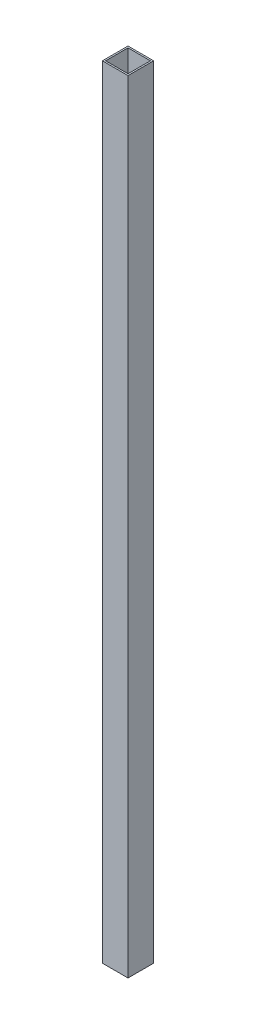
ISO-10303-21;
HEADER;
FILE_DESCRIPTION(('STEP AP214'),'2;1');
FILE_NAME('part.step','',(''),(''),'','','');
FILE_SCHEMA(('AUTOMOTIVE_DESIGN { 1 0 10303 214 1 1 1 1 }'));
ENDSEC;
DATA;
#1=APPLICATION_CONTEXT('core data for automotive mechanical design processes');
#2=APPLICATION_PROTOCOL_DEFINITION('international standard','automotive_design',2000,#1);
#3=PRODUCT_CONTEXT('',#1,'mechanical');
#4=PRODUCT('Part','Part','',(#3));
#5=PRODUCT_RELATED_PRODUCT_CATEGORY('part','',(#4));
#6=PRODUCT_DEFINITION_FORMATION('','',#4);
#7=PRODUCT_DEFINITION_CONTEXT('part definition',#1,'design');
#8=PRODUCT_DEFINITION('design','',#6,#7);
#9=PRODUCT_DEFINITION_SHAPE('','',#8);
#10=(LENGTH_UNIT() NAMED_UNIT(*) SI_UNIT(.MILLI.,.METRE.));
#11=(NAMED_UNIT(*) PLANE_ANGLE_UNIT() SI_UNIT($,.RADIAN.));
#12=(NAMED_UNIT(*) SI_UNIT($,.STERADIAN.) SOLID_ANGLE_UNIT());
#13=UNCERTAINTY_MEASURE_WITH_UNIT(LENGTH_MEASURE(1.E-05),#10,'distance_accuracy_value','');
#14=(GEOMETRIC_REPRESENTATION_CONTEXT(3) GLOBAL_UNCERTAINTY_ASSIGNED_CONTEXT((#13)) GLOBAL_UNIT_ASSIGNED_CONTEXT((#10,
#11,#12)) REPRESENTATION_CONTEXT('',''));
#15=CARTESIAN_POINT('',(0.,0.,0.));
#16=DIRECTION('',(0.,0.,1.));
#17=DIRECTION('',(1.,0.,0.));
#18=AXIS2_PLACEMENT_3D('',#15,#16,#17);
#19=CARTESIAN_POINT('',(0.,774.7,0.));
#20=DIRECTION('',(0.,-1.,0.));
#21=DIRECTION('',(0.,0.,-1.));
#22=AXIS2_PLACEMENT_3D('',#19,#20,#21);
#23=PLANE('',#22);
#24=DIRECTION('',(0.,0.,-1.));
#25=VECTOR('',#24,1.);
#26=CARTESIAN_POINT('',(12.7,774.7,12.7));
#27=LINE('',#26,#25);
#28=CARTESIAN_POINT('',(12.7,774.7,12.7));
#29=VERTEX_POINT('',#28);
#30=CARTESIAN_POINT('',(12.7,774.7,-12.7));
#31=VERTEX_POINT('',#30);
#32=EDGE_CURVE('E133',#29,#31,#27,.T.);
#33=ORIENTED_EDGE('',*,*,#32,.T.);
#34=DIRECTION('',(-1.,0.,0.));
#35=VECTOR('',#34,1.);
#36=CARTESIAN_POINT('',(-12.7,774.7,-12.7));
#37=LINE('',#36,#35);
#38=CARTESIAN_POINT('',(-12.7,774.7,-12.7));
#39=VERTEX_POINT('',#38);
#40=EDGE_CURVE('E136',#31,#39,#37,.T.);
#41=ORIENTED_EDGE('',*,*,#40,.T.);
#42=DIRECTION('',(0.,0.,1.));
#43=VECTOR('',#42,1.);
#44=CARTESIAN_POINT('',(-12.7,774.7,12.7));
#45=LINE('',#44,#43);
#46=CARTESIAN_POINT('',(-12.7,774.7,12.7));
#47=VERTEX_POINT('',#46);
#48=EDGE_CURVE('E139',#39,#47,#45,.T.);
#49=ORIENTED_EDGE('',*,*,#48,.T.);
#50=DIRECTION('',(1.,0.,0.));
#51=VECTOR('',#50,1.);
#52=CARTESIAN_POINT('',(-12.7,774.7,12.7));
#53=LINE('',#52,#51);
#54=EDGE_CURVE('E141',#47,#29,#53,.T.);
#55=ORIENTED_EDGE('',*,*,#54,.T.);
#56=EDGE_LOOP('',(#33,#41,#49,#55));
#57=FACE_BOUND('',#56,.T.);
#58=DIRECTION('',(0.,0.,-1.));
#59=VECTOR('',#58,1.);
#60=CARTESIAN_POINT('',(11.1125,774.7,11.1125));
#61=LINE('',#60,#59);
#62=CARTESIAN_POINT('',(11.1125,774.7,11.1125));
#63=VERTEX_POINT('',#62);
#64=CARTESIAN_POINT('',(11.1125,774.7,-11.1125));
#65=VERTEX_POINT('',#64);
#66=EDGE_CURVE('E97',#63,#65,#61,.T.);
#67=ORIENTED_EDGE('',*,*,#66,.F.);
#68=DIRECTION('',(1.,0.,0.));
#69=VECTOR('',#68,1.);
#70=CARTESIAN_POINT('',(-11.1125,774.7,11.1125));
#71=LINE('',#70,#69);
#72=CARTESIAN_POINT('',(-11.1125,774.7,11.1125));
#73=VERTEX_POINT('',#72);
#74=EDGE_CURVE('E119',#73,#63,#71,.T.);
#75=ORIENTED_EDGE('',*,*,#74,.F.);
#76=DIRECTION('',(0.,0.,1.));
#77=VECTOR('',#76,1.);
#78=CARTESIAN_POINT('',(-11.1125,774.7,11.1125));
#79=LINE('',#78,#77);
#80=CARTESIAN_POINT('',(-11.1125,774.7,-11.1125));
#81=VERTEX_POINT('',#80);
#82=EDGE_CURVE('E117',#81,#73,#79,.T.);
#83=ORIENTED_EDGE('',*,*,#82,.F.);
#84=DIRECTION('',(-1.,0.,0.));
#85=VECTOR('',#84,1.);
#86=CARTESIAN_POINT('',(-11.1125,774.7,-11.1125));
#87=LINE('',#86,#85);
#88=EDGE_CURVE('E105',#65,#81,#87,.T.);
#89=ORIENTED_EDGE('',*,*,#88,.F.);
#90=EDGE_LOOP('',(#67,#75,#83,#89));
#91=FACE_BOUND('',#90,.T.);
#92=ADVANCED_FACE('F32',(#57,#91),#23,.F.);
#93=CARTESIAN_POINT('',(0.,0.,0.));
#94=DIRECTION('',(0.,-1.,0.));
#95=DIRECTION('',(0.,0.,-1.));
#96=AXIS2_PLACEMENT_3D('',#93,#94,#95);
#97=PLANE('',#96);
#98=DIRECTION('',(0.,0.,-1.));
#99=VECTOR('',#98,1.);
#100=CARTESIAN_POINT('',(12.7,0.,12.7));
#101=LINE('',#100,#99);
#102=CARTESIAN_POINT('',(12.7,0.,12.7));
#103=VERTEX_POINT('',#102);
#104=CARTESIAN_POINT('',(12.7,0.,-12.7));
#105=VERTEX_POINT('',#104);
#106=EDGE_CURVE('E113',#103,#105,#101,.T.);
#107=ORIENTED_EDGE('',*,*,#106,.F.);
#108=DIRECTION('',(1.,0.,0.));
#109=VECTOR('',#108,1.);
#110=CARTESIAN_POINT('',(-12.7,0.,12.7));
#111=LINE('',#110,#109);
#112=CARTESIAN_POINT('',(-12.7,0.,12.7));
#113=VERTEX_POINT('',#112);
#114=EDGE_CURVE('E137',#113,#103,#111,.T.);
#115=ORIENTED_EDGE('',*,*,#114,.F.);
#116=DIRECTION('',(0.,0.,1.));
#117=VECTOR('',#116,1.);
#118=CARTESIAN_POINT('',(-12.7,0.,12.7));
#119=LINE('',#118,#117);
#120=CARTESIAN_POINT('',(-12.7,0.,-12.7));
#121=VERTEX_POINT('',#120);
#122=EDGE_CURVE('E148',#121,#113,#119,.T.);
#123=ORIENTED_EDGE('',*,*,#122,.F.);
#124=DIRECTION('',(-1.,0.,0.));
#125=VECTOR('',#124,1.);
#126=CARTESIAN_POINT('',(-12.7,0.,-12.7));
#127=LINE('',#126,#125);
#128=EDGE_CURVE('E146',#105,#121,#127,.T.);
#129=ORIENTED_EDGE('',*,*,#128,.F.);
#130=EDGE_LOOP('',(#107,#115,#123,#129));
#131=FACE_BOUND('',#130,.T.);
#132=DIRECTION('',(1.,0.,0.));
#133=VECTOR('',#132,1.);
#134=CARTESIAN_POINT('',(-11.1125,0.,11.1125));
#135=LINE('',#134,#133);
#136=CARTESIAN_POINT('',(-11.1125,0.,11.1125));
#137=VERTEX_POINT('',#136);
#138=CARTESIAN_POINT('',(11.1125,0.,11.1125));
#139=VERTEX_POINT('',#138);
#140=EDGE_CURVE('E106',#137,#139,#135,.T.);
#141=ORIENTED_EDGE('',*,*,#140,.T.);
#142=DIRECTION('',(0.,0.,-1.));
#143=VECTOR('',#142,1.);
#144=CARTESIAN_POINT('',(11.1125,0.,11.1125));
#145=LINE('',#144,#143);
#146=CARTESIAN_POINT('',(11.1125,0.,-11.1125));
#147=VERTEX_POINT('',#146);
#148=EDGE_CURVE('E55',#139,#147,#145,.T.);
#149=ORIENTED_EDGE('',*,*,#148,.T.);
#150=DIRECTION('',(-1.,0.,0.));
#151=VECTOR('',#150,1.);
#152=CARTESIAN_POINT('',(-11.1125,0.,-11.1125));
#153=LINE('',#152,#151);
#154=CARTESIAN_POINT('',(-11.1125,0.,-11.1125));
#155=VERTEX_POINT('',#154);
#156=EDGE_CURVE('E112',#147,#155,#153,.T.);
#157=ORIENTED_EDGE('',*,*,#156,.T.);
#158=DIRECTION('',(0.,0.,1.));
#159=VECTOR('',#158,1.);
#160=CARTESIAN_POINT('',(-11.1125,0.,11.1125));
#161=LINE('',#160,#159);
#162=EDGE_CURVE('E125',#155,#137,#161,.T.);
#163=ORIENTED_EDGE('',*,*,#162,.T.);
#164=EDGE_LOOP('',(#141,#149,#157,#163));
#165=FACE_BOUND('',#164,.T.);
#166=ADVANCED_FACE('F166',(#131,#165),#97,.T.);
#167=CARTESIAN_POINT('',(12.7,774.7,12.7));
#168=DIRECTION('',(-1.,0.,0.));
#169=DIRECTION('',(0.,0.,1.));
#170=AXIS2_PLACEMENT_3D('',#167,#168,#169);
#171=PLANE('',#170);
#172=ORIENTED_EDGE('',*,*,#106,.T.);
#173=DIRECTION('',(0.,-1.,0.));
#174=VECTOR('',#173,1.);
#175=CARTESIAN_POINT('',(12.7,774.7,-12.7));
#176=LINE('',#175,#174);
#177=EDGE_CURVE('E11',#31,#105,#176,.T.);
#178=ORIENTED_EDGE('',*,*,#177,.F.);
#179=ORIENTED_EDGE('',*,*,#32,.F.);
#180=DIRECTION('',(0.,-1.,0.));
#181=VECTOR('',#180,1.);
#182=CARTESIAN_POINT('',(12.7,774.7,12.7));
#183=LINE('',#182,#181);
#184=EDGE_CURVE('E143',#29,#103,#183,.T.);
#185=ORIENTED_EDGE('',*,*,#184,.T.);
#186=EDGE_LOOP('',(#172,#178,#179,#185));
#187=FACE_BOUND('',#186,.T.);
#188=ADVANCED_FACE('F34',(#187),#171,.F.);
#189=CARTESIAN_POINT('',(-12.7,774.7,-12.7));
#190=DIRECTION('',(0.,0.,1.));
#191=DIRECTION('',(1.,0.,0.));
#192=AXIS2_PLACEMENT_3D('',#189,#190,#191);
#193=PLANE('',#192);
#194=ORIENTED_EDGE('',*,*,#128,.T.);
#195=DIRECTION('',(0.,-1.,0.));
#196=VECTOR('',#195,1.);
#197=CARTESIAN_POINT('',(-12.7,774.7,-12.7));
#198=LINE('',#197,#196);
#199=EDGE_CURVE('E40',#39,#121,#198,.T.);
#200=ORIENTED_EDGE('',*,*,#199,.F.);
#201=ORIENTED_EDGE('',*,*,#40,.F.);
#202=ORIENTED_EDGE('',*,*,#177,.T.);
#203=EDGE_LOOP('',(#194,#200,#201,#202));
#204=FACE_BOUND('',#203,.T.);
#205=ADVANCED_FACE('F176',(#204),#193,.F.);
#206=CARTESIAN_POINT('',(-12.7,774.7,12.7));
#207=DIRECTION('',(1.,0.,0.));
#208=DIRECTION('',(0.,0.,-1.));
#209=AXIS2_PLACEMENT_3D('',#206,#207,#208);
#210=PLANE('',#209);
#211=ORIENTED_EDGE('',*,*,#122,.T.);
#212=DIRECTION('',(0.,-1.,0.));
#213=VECTOR('',#212,1.);
#214=CARTESIAN_POINT('',(-12.7,774.7,12.7));
#215=LINE('',#214,#213);
#216=EDGE_CURVE('E153',#47,#113,#215,.T.);
#217=ORIENTED_EDGE('',*,*,#216,.F.);
#218=ORIENTED_EDGE('',*,*,#48,.F.);
#219=ORIENTED_EDGE('',*,*,#199,.T.);
#220=EDGE_LOOP('',(#211,#217,#218,#219));
#221=FACE_BOUND('',#220,.T.);
#222=ADVANCED_FACE('F160',(#221),#210,.F.);
#223=CARTESIAN_POINT('',(-12.7,774.7,12.7));
#224=DIRECTION('',(0.,0.,-1.));
#225=DIRECTION('',(-1.,0.,0.));
#226=AXIS2_PLACEMENT_3D('',#223,#224,#225);
#227=PLANE('',#226);
#228=ORIENTED_EDGE('',*,*,#114,.T.);
#229=ORIENTED_EDGE('',*,*,#184,.F.);
#230=ORIENTED_EDGE('',*,*,#54,.F.);
#231=ORIENTED_EDGE('',*,*,#216,.T.);
#232=EDGE_LOOP('',(#228,#229,#230,#231));
#233=FACE_BOUND('',#232,.T.);
#234=ADVANCED_FACE('F170',(#233),#227,.F.);
#235=CARTESIAN_POINT('',(11.1125,774.7,11.1125));
#236=DIRECTION('',(-1.,0.,0.));
#237=DIRECTION('',(0.,0.,1.));
#238=AXIS2_PLACEMENT_3D('',#235,#236,#237);
#239=PLANE('',#238);
#240=ORIENTED_EDGE('',*,*,#148,.F.);
#241=DIRECTION('',(0.,-1.,0.));
#242=VECTOR('',#241,1.);
#243=CARTESIAN_POINT('',(11.1125,774.7,11.1125));
#244=LINE('',#243,#242);
#245=EDGE_CURVE('E101',#63,#139,#244,.T.);
#246=ORIENTED_EDGE('',*,*,#245,.F.);
#247=ORIENTED_EDGE('',*,*,#66,.T.);
#248=DIRECTION('',(0.,-1.,0.));
#249=VECTOR('',#248,1.);
#250=CARTESIAN_POINT('',(11.1125,774.7,-11.1125));
#251=LINE('',#250,#249);
#252=EDGE_CURVE('E100',#65,#147,#251,.T.);
#253=ORIENTED_EDGE('',*,*,#252,.T.);
#254=EDGE_LOOP('',(#240,#246,#247,#253));
#255=FACE_BOUND('',#254,.T.);
#256=ADVANCED_FACE('F99',(#255),#239,.T.);
#257=CARTESIAN_POINT('',(-11.1125,774.7,-11.1125));
#258=DIRECTION('',(0.,0.,1.));
#259=DIRECTION('',(1.,0.,0.));
#260=AXIS2_PLACEMENT_3D('',#257,#258,#259);
#261=PLANE('',#260);
#262=ORIENTED_EDGE('',*,*,#156,.F.);
#263=ORIENTED_EDGE('',*,*,#252,.F.);
#264=ORIENTED_EDGE('',*,*,#88,.T.);
#265=DIRECTION('',(0.,-1.,0.));
#266=VECTOR('',#265,1.);
#267=CARTESIAN_POINT('',(-11.1125,774.7,-11.1125));
#268=LINE('',#267,#266);
#269=EDGE_CURVE('E114',#81,#155,#268,.T.);
#270=ORIENTED_EDGE('',*,*,#269,.T.);
#271=EDGE_LOOP('',(#262,#263,#264,#270));
#272=FACE_BOUND('',#271,.T.);
#273=ADVANCED_FACE('F109',(#272),#261,.T.);
#274=CARTESIAN_POINT('',(-11.1125,774.7,11.1125));
#275=DIRECTION('',(1.,0.,0.));
#276=DIRECTION('',(0.,0.,-1.));
#277=AXIS2_PLACEMENT_3D('',#274,#275,#276);
#278=PLANE('',#277);
#279=ORIENTED_EDGE('',*,*,#162,.F.);
#280=ORIENTED_EDGE('',*,*,#269,.F.);
#281=ORIENTED_EDGE('',*,*,#82,.T.);
#282=DIRECTION('',(0.,-1.,0.));
#283=VECTOR('',#282,1.);
#284=CARTESIAN_POINT('',(-11.1125,774.7,11.1125));
#285=LINE('',#284,#283);
#286=EDGE_CURVE('E47',#73,#137,#285,.T.);
#287=ORIENTED_EDGE('',*,*,#286,.T.);
#288=EDGE_LOOP('',(#279,#280,#281,#287));
#289=FACE_BOUND('',#288,.T.);
#290=ADVANCED_FACE('F199',(#289),#278,.T.);
#291=CARTESIAN_POINT('',(-11.1125,774.7,11.1125));
#292=DIRECTION('',(0.,0.,-1.));
#293=DIRECTION('',(-1.,0.,0.));
#294=AXIS2_PLACEMENT_3D('',#291,#292,#293);
#295=PLANE('',#294);
#296=ORIENTED_EDGE('',*,*,#140,.F.);
#297=ORIENTED_EDGE('',*,*,#286,.F.);
#298=ORIENTED_EDGE('',*,*,#74,.T.);
#299=ORIENTED_EDGE('',*,*,#245,.T.);
#300=EDGE_LOOP('',(#296,#297,#298,#299));
#301=FACE_BOUND('',#300,.T.);
#302=ADVANCED_FACE('F203',(#301),#295,.T.);
#303=CLOSED_SHELL('',(#92,#166,#188,#205,#222,#234,#256,#273,#290,#302));
#304=MANIFOLD_SOLID_BREP('B2',#303);
#305=ADVANCED_BREP_SHAPE_REPRESENTATION('',(#18,#304),#14);
#306=SHAPE_DEFINITION_REPRESENTATION(#9,#305);
ENDSEC;
END-ISO-10303-21;
